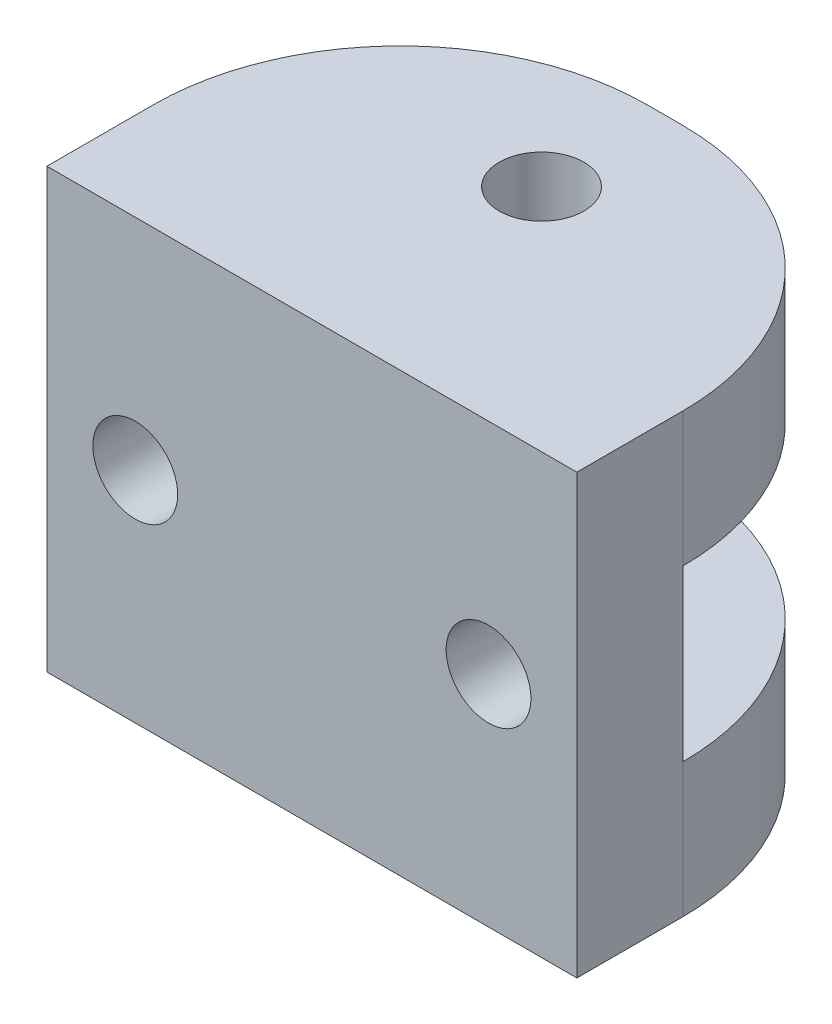
ISO-10303-21;
HEADER;
FILE_DESCRIPTION(('STEP AP214'),'2;1');
FILE_NAME('part.step','',(''),(''),'','','');
FILE_SCHEMA(('AUTOMOTIVE_DESIGN { 1 0 10303 214 1 1 1 1 }'));
ENDSEC;
DATA;
#1=APPLICATION_CONTEXT('core data for automotive mechanical design processes');
#2=APPLICATION_PROTOCOL_DEFINITION('international standard','automotive_design',2000,#1);
#3=PRODUCT_CONTEXT('',#1,'mechanical');
#4=PRODUCT('Part','Part','',(#3));
#5=PRODUCT_RELATED_PRODUCT_CATEGORY('part','',(#4));
#6=PRODUCT_DEFINITION_FORMATION('','',#4);
#7=PRODUCT_DEFINITION_CONTEXT('part definition',#1,'design');
#8=PRODUCT_DEFINITION('design','',#6,#7);
#9=PRODUCT_DEFINITION_SHAPE('','',#8);
#10=(LENGTH_UNIT() NAMED_UNIT(*) SI_UNIT(.MILLI.,.METRE.));
#11=(NAMED_UNIT(*) PLANE_ANGLE_UNIT() SI_UNIT($,.RADIAN.));
#12=(NAMED_UNIT(*) SI_UNIT($,.STERADIAN.) SOLID_ANGLE_UNIT());
#13=UNCERTAINTY_MEASURE_WITH_UNIT(LENGTH_MEASURE(1.E-05),#10,'distance_accuracy_value','');
#14=(GEOMETRIC_REPRESENTATION_CONTEXT(3) GLOBAL_UNCERTAINTY_ASSIGNED_CONTEXT((#13)) GLOBAL_UNIT_ASSIGNED_CONTEXT((#10,
#11,#12)) REPRESENTATION_CONTEXT('',''));
#15=CARTESIAN_POINT('',(0.,0.,0.));
#16=DIRECTION('',(0.,0.,1.));
#17=DIRECTION('',(1.,0.,0.));
#18=AXIS2_PLACEMENT_3D('',#15,#16,#17);
#19=CARTESIAN_POINT('',(75.,0.,0.));
#20=DIRECTION('',(0.,0.,-1.));
#21=DIRECTION('',(-1.,0.,0.));
#22=AXIS2_PLACEMENT_3D('',#19,#20,#21);
#23=PLANE('',#22);
#24=CARTESIAN_POINT('',(62.5,31.,0.));
#25=DIRECTION('',(0.,0.,1.));
#26=DIRECTION('',(1.,0.,0.));
#27=AXIS2_PLACEMENT_3D('',#24,#25,#26);
#28=CIRCLE('',#27,5.99999999999998);
#29=CARTESIAN_POINT('',(68.5,31.,0.));
#30=VERTEX_POINT('',#29);
#31=EDGE_CURVE('E151',#30,#30,#28,.T.);
#32=ORIENTED_EDGE('',*,*,#31,.F.);
#33=EDGE_LOOP('',(#32));
#34=FACE_BOUND('',#33,.T.);
#35=CARTESIAN_POINT('',(12.5,31.,0.));
#36=DIRECTION('',(0.,0.,1.));
#37=DIRECTION('',(1.,0.,0.));
#38=AXIS2_PLACEMENT_3D('',#35,#36,#37);
#39=CIRCLE('',#38,6.);
#40=CARTESIAN_POINT('',(18.5,31.,0.));
#41=VERTEX_POINT('',#40);
#42=EDGE_CURVE('E283',#41,#41,#39,.T.);
#43=ORIENTED_EDGE('',*,*,#42,.F.);
#44=EDGE_LOOP('',(#43));
#45=FACE_BOUND('',#44,.T.);
#46=DIRECTION('',(0.,-1.,0.));
#47=VECTOR('',#46,1.);
#48=CARTESIAN_POINT('',(0.,0.,0.));
#49=LINE('',#48,#47);
#50=CARTESIAN_POINT('',(0.,62.,0.));
#51=VERTEX_POINT('',#50);
#52=CARTESIAN_POINT('',(0.,0.,0.));
#53=VERTEX_POINT('',#52);
#54=EDGE_CURVE('E136',#51,#53,#49,.T.);
#55=ORIENTED_EDGE('',*,*,#54,.T.);
#56=DIRECTION('',(-1.,0.,0.));
#57=VECTOR('',#56,1.);
#58=CARTESIAN_POINT('',(75.,0.,0.));
#59=LINE('',#58,#57);
#60=CARTESIAN_POINT('',(75.,0.,0.));
#61=VERTEX_POINT('',#60);
#62=EDGE_CURVE('E115',#61,#53,#59,.T.);
#63=ORIENTED_EDGE('',*,*,#62,.F.);
#64=DIRECTION('',(0.,-1.,0.));
#65=VECTOR('',#64,1.);
#66=CARTESIAN_POINT('',(75.,0.,0.));
#67=LINE('',#66,#65);
#68=CARTESIAN_POINT('',(75.,62.,0.));
#69=VERTEX_POINT('',#68);
#70=EDGE_CURVE('E123',#69,#61,#67,.T.);
#71=ORIENTED_EDGE('',*,*,#70,.F.);
#72=DIRECTION('',(-1.,0.,0.));
#73=VECTOR('',#72,1.);
#74=CARTESIAN_POINT('',(75.,62.,0.));
#75=LINE('',#74,#73);
#76=EDGE_CURVE('E203',#69,#51,#75,.T.);
#77=ORIENTED_EDGE('',*,*,#76,.T.);
#78=EDGE_LOOP('',(#55,#63,#71,#77));
#79=FACE_BOUND('',#78,.T.);
#80=ADVANCED_FACE('F32',(#34,#45,#79),#23,.F.);
#81=CARTESIAN_POINT('',(75.,0.,0.));
#82=DIRECTION('',(0.,1.,0.));
#83=DIRECTION('',(0.,0.,1.));
#84=AXIS2_PLACEMENT_3D('',#81,#82,#83);
#85=PLANE('',#84);
#86=CARTESIAN_POINT('',(37.5,0.,-32.5));
#87=DIRECTION('',(0.,1.,0.));
#88=DIRECTION('',(0.,0.,1.));
#89=AXIS2_PLACEMENT_3D('',#86,#87,#88);
#90=CIRCLE('',#89,5.99999999999999);
#91=CARTESIAN_POINT('',(37.5,0.,-26.5));
#92=VERTEX_POINT('',#91);
#93=EDGE_CURVE('E408',#92,#92,#90,.T.);
#94=ORIENTED_EDGE('',*,*,#93,.T.);
#95=EDGE_LOOP('',(#94));
#96=FACE_BOUND('',#95,.T.);
#97=DIRECTION('',(-1.,0.,0.));
#98=VECTOR('',#97,1.);
#99=CARTESIAN_POINT('',(75.,0.,-50.));
#100=LINE('',#99,#98);
#101=CARTESIAN_POINT('',(40.,0.,-50.));
#102=VERTEX_POINT('',#101);
#103=CARTESIAN_POINT('',(35.,0.,-50.));
#104=VERTEX_POINT('',#103);
#105=EDGE_CURVE('E138',#102,#104,#100,.T.);
#106=ORIENTED_EDGE('',*,*,#105,.F.);
#107=CARTESIAN_POINT('',(40.,0.,-15.));
#108=DIRECTION('',(0.,1.,0.));
#109=DIRECTION('',(0.,0.,1.));
#110=AXIS2_PLACEMENT_3D('',#107,#108,#109);
#111=CIRCLE('',#110,35.);
#112=CARTESIAN_POINT('',(75.,0.,-15.));
#113=VERTEX_POINT('',#112);
#114=EDGE_CURVE('E118',#102,#113,#111,.F.);
#115=ORIENTED_EDGE('',*,*,#114,.T.);
#116=DIRECTION('',(0.,0.,-1.));
#117=VECTOR('',#116,1.);
#118=CARTESIAN_POINT('',(75.,0.,0.));
#119=LINE('',#118,#117);
#120=EDGE_CURVE('E109',#61,#113,#119,.T.);
#121=ORIENTED_EDGE('',*,*,#120,.F.);
#122=ORIENTED_EDGE('',*,*,#62,.T.);
#123=DIRECTION('',(0.,0.,-1.));
#124=VECTOR('',#123,1.);
#125=CARTESIAN_POINT('',(0.,0.,0.));
#126=LINE('',#125,#124);
#127=CARTESIAN_POINT('',(0.,0.,-15.));
#128=VERTEX_POINT('',#127);
#129=EDGE_CURVE('E293',#53,#128,#126,.T.);
#130=ORIENTED_EDGE('',*,*,#129,.T.);
#131=CARTESIAN_POINT('',(35.,0.,-15.));
#132=DIRECTION('',(0.,1.,0.));
#133=DIRECTION('',(0.,0.,1.));
#134=AXIS2_PLACEMENT_3D('',#131,#132,#133);
#135=CIRCLE('',#134,35.);
#136=EDGE_CURVE('E164',#128,#104,#135,.F.);
#137=ORIENTED_EDGE('',*,*,#136,.T.);
#138=EDGE_LOOP('',(#106,#115,#121,#122,#130,#137));
#139=FACE_BOUND('',#138,.T.);
#140=ADVANCED_FACE('F112',(#96,#139),#85,.F.);
#141=CARTESIAN_POINT('',(75.,19.,-50.));
#142=DIRECTION('',(0.,0.,1.));
#143=DIRECTION('',(1.,0.,0.));
#144=AXIS2_PLACEMENT_3D('',#141,#142,#143);
#145=PLANE('',#144);
#146=DIRECTION('',(-1.,0.,0.));
#147=VECTOR('',#146,1.);
#148=CARTESIAN_POINT('',(75.,19.,-50.));
#149=LINE('',#148,#147);
#150=CARTESIAN_POINT('',(40.,19.,-50.));
#151=VERTEX_POINT('',#150);
#152=CARTESIAN_POINT('',(35.,19.,-50.));
#153=VERTEX_POINT('',#152);
#154=EDGE_CURVE('E143',#151,#153,#149,.T.);
#155=ORIENTED_EDGE('',*,*,#154,.F.);
#156=DIRECTION('',(0.,1.,0.));
#157=VECTOR('',#156,1.);
#158=CARTESIAN_POINT('',(40.,19.,-50.));
#159=LINE('',#158,#157);
#160=EDGE_CURVE('E162',#151,#102,#159,.F.);
#161=ORIENTED_EDGE('',*,*,#160,.T.);
#162=ORIENTED_EDGE('',*,*,#105,.T.);
#163=DIRECTION('',(0.,1.,0.));
#164=VECTOR('',#163,1.);
#165=CARTESIAN_POINT('',(35.,19.,-50.));
#166=LINE('',#165,#164);
#167=EDGE_CURVE('E159',#104,#153,#166,.T.);
#168=ORIENTED_EDGE('',*,*,#167,.T.);
#169=EDGE_LOOP('',(#155,#161,#162,#168));
#170=FACE_BOUND('',#169,.T.);
#171=ADVANCED_FACE('F215',(#170),#145,.F.);
#172=CARTESIAN_POINT('',(75.,19.,-15.));
#173=DIRECTION('',(0.,-1.,0.));
#174=DIRECTION('',(0.,0.,-1.));
#175=AXIS2_PLACEMENT_3D('',#172,#173,#174);
#176=PLANE('',#175);
#177=CARTESIAN_POINT('',(37.5,19.,-32.5));
#178=DIRECTION('',(0.,-1.,0.));
#179=DIRECTION('',(0.,0.,-1.));
#180=AXIS2_PLACEMENT_3D('',#177,#178,#179);
#181=CIRCLE('',#180,5.99999999999999);
#182=CARTESIAN_POINT('',(37.5,19.,-38.5));
#183=VERTEX_POINT('',#182);
#184=EDGE_CURVE('E286',#183,#183,#181,.T.);
#185=ORIENTED_EDGE('',*,*,#184,.T.);
#186=EDGE_LOOP('',(#185));
#187=FACE_BOUND('',#186,.T.);
#188=DIRECTION('',(-1.,0.,0.));
#189=VECTOR('',#188,1.);
#190=CARTESIAN_POINT('',(75.,19.,-15.));
#191=LINE('',#190,#189);
#192=CARTESIAN_POINT('',(75.,19.,-15.));
#193=VERTEX_POINT('',#192);
#194=CARTESIAN_POINT('',(0.,19.,-15.));
#195=VERTEX_POINT('',#194);
#196=EDGE_CURVE('E195',#193,#195,#191,.T.);
#197=ORIENTED_EDGE('',*,*,#196,.F.);
#198=CARTESIAN_POINT('',(40.,19.,-15.));
#199=DIRECTION('',(0.,-1.,0.));
#200=DIRECTION('',(0.,0.,-1.));
#201=AXIS2_PLACEMENT_3D('',#198,#199,#200);
#202=CIRCLE('',#201,35.);
#203=EDGE_CURVE('E157',#193,#151,#202,.F.);
#204=ORIENTED_EDGE('',*,*,#203,.T.);
#205=ORIENTED_EDGE('',*,*,#154,.T.);
#206=CARTESIAN_POINT('',(35.,19.,-15.));
#207=DIRECTION('',(0.,-1.,0.));
#208=DIRECTION('',(0.,0.,-1.));
#209=AXIS2_PLACEMENT_3D('',#206,#207,#208);
#210=CIRCLE('',#209,35.);
#211=EDGE_CURVE('E155',#153,#195,#210,.F.);
#212=ORIENTED_EDGE('',*,*,#211,.T.);
#213=EDGE_LOOP('',(#197,#204,#205,#212));
#214=FACE_BOUND('',#213,.T.);
#215=ADVANCED_FACE('F212',(#187,#214),#176,.F.);
#216=CARTESIAN_POINT('',(75.,43.,-15.));
#217=DIRECTION('',(0.,0.,1.));
#218=DIRECTION('',(1.,0.,0.));
#219=AXIS2_PLACEMENT_3D('',#216,#217,#218);
#220=PLANE('',#219);
#221=CARTESIAN_POINT('',(62.5,31.,-15.));
#222=DIRECTION('',(0.,0.,1.));
#223=DIRECTION('',(1.,0.,0.));
#224=AXIS2_PLACEMENT_3D('',#221,#222,#223);
#225=CIRCLE('',#224,5.99999999999998);
#226=CARTESIAN_POINT('',(68.5,31.,-15.));
#227=VERTEX_POINT('',#226);
#228=EDGE_CURVE('E150',#227,#227,#225,.T.);
#229=ORIENTED_EDGE('',*,*,#228,.T.);
#230=EDGE_LOOP('',(#229));
#231=FACE_BOUND('',#230,.T.);
#232=CARTESIAN_POINT('',(12.5,31.,-15.));
#233=DIRECTION('',(0.,0.,1.));
#234=DIRECTION('',(1.,0.,0.));
#235=AXIS2_PLACEMENT_3D('',#232,#233,#234);
#236=CIRCLE('',#235,6.);
#237=CARTESIAN_POINT('',(18.5,31.,-15.));
#238=VERTEX_POINT('',#237);
#239=EDGE_CURVE('E147',#238,#238,#236,.T.);
#240=ORIENTED_EDGE('',*,*,#239,.T.);
#241=EDGE_LOOP('',(#240));
#242=FACE_BOUND('',#241,.T.);
#243=DIRECTION('',(0.,1.,0.));
#244=VECTOR('',#243,1.);
#245=CARTESIAN_POINT('',(0.,43.,-15.));
#246=LINE('',#245,#244);
#247=CARTESIAN_POINT('',(0.,43.,-15.));
#248=VERTEX_POINT('',#247);
#249=EDGE_CURVE('E194',#195,#248,#246,.T.);
#250=ORIENTED_EDGE('',*,*,#249,.T.);
#251=DIRECTION('',(-1.,0.,0.));
#252=VECTOR('',#251,1.);
#253=CARTESIAN_POINT('',(75.,43.,-15.));
#254=LINE('',#253,#252);
#255=CARTESIAN_POINT('',(75.,43.,-15.));
#256=VERTEX_POINT('',#255);
#257=EDGE_CURVE('E182',#256,#248,#254,.T.);
#258=ORIENTED_EDGE('',*,*,#257,.F.);
#259=DIRECTION('',(0.,1.,0.));
#260=VECTOR('',#259,1.);
#261=CARTESIAN_POINT('',(75.,43.,-15.));
#262=LINE('',#261,#260);
#263=EDGE_CURVE('E122',#193,#256,#262,.T.);
#264=ORIENTED_EDGE('',*,*,#263,.F.);
#265=ORIENTED_EDGE('',*,*,#196,.T.);
#266=EDGE_LOOP('',(#250,#258,#264,#265));
#267=FACE_BOUND('',#266,.T.);
#268=ADVANCED_FACE('F192',(#231,#242,#267),#220,.F.);
#269=CARTESIAN_POINT('',(75.,43.,-50.));
#270=DIRECTION('',(0.,1.,0.));
#271=DIRECTION('',(0.,0.,1.));
#272=AXIS2_PLACEMENT_3D('',#269,#270,#271);
#273=PLANE('',#272);
#274=CARTESIAN_POINT('',(37.5,43.,-32.5));
#275=DIRECTION('',(0.,1.,0.));
#276=DIRECTION('',(0.,0.,1.));
#277=AXIS2_PLACEMENT_3D('',#274,#275,#276);
#278=CIRCLE('',#277,5.99999999999999);
#279=CARTESIAN_POINT('',(37.5,43.,-26.5));
#280=VERTEX_POINT('',#279);
#281=EDGE_CURVE('E405',#280,#280,#278,.T.);
#282=ORIENTED_EDGE('',*,*,#281,.T.);
#283=EDGE_LOOP('',(#282));
#284=FACE_BOUND('',#283,.T.);
#285=ORIENTED_EDGE('',*,*,#257,.T.);
#286=CARTESIAN_POINT('',(35.,43.,-15.));
#287=DIRECTION('',(0.,1.,0.));
#288=DIRECTION('',(0.,0.,1.));
#289=AXIS2_PLACEMENT_3D('',#286,#287,#288);
#290=CIRCLE('',#289,35.);
#291=CARTESIAN_POINT('',(35.,43.,-50.));
#292=VERTEX_POINT('',#291);
#293=EDGE_CURVE('E11',#248,#292,#290,.F.);
#294=ORIENTED_EDGE('',*,*,#293,.T.);
#295=DIRECTION('',(-1.,0.,0.));
#296=VECTOR('',#295,1.);
#297=CARTESIAN_POINT('',(75.,43.,-50.));
#298=LINE('',#297,#296);
#299=CARTESIAN_POINT('',(40.,43.,-50.));
#300=VERTEX_POINT('',#299);
#301=EDGE_CURVE('E183',#300,#292,#298,.T.);
#302=ORIENTED_EDGE('',*,*,#301,.F.);
#303=CARTESIAN_POINT('',(40.,43.,-15.));
#304=DIRECTION('',(0.,1.,0.));
#305=DIRECTION('',(0.,0.,1.));
#306=AXIS2_PLACEMENT_3D('',#303,#304,#305);
#307=CIRCLE('',#306,35.);
#308=EDGE_CURVE('E40',#300,#256,#307,.F.);
#309=ORIENTED_EDGE('',*,*,#308,.T.);
#310=EDGE_LOOP('',(#285,#294,#302,#309));
#311=FACE_BOUND('',#310,.T.);
#312=ADVANCED_FACE('F180',(#284,#311),#273,.F.);
#313=CARTESIAN_POINT('',(75.,62.,-50.));
#314=DIRECTION('',(0.,0.,1.));
#315=DIRECTION('',(1.,0.,0.));
#316=AXIS2_PLACEMENT_3D('',#313,#314,#315);
#317=PLANE('',#316);
#318=ORIENTED_EDGE('',*,*,#301,.T.);
#319=DIRECTION('',(0.,1.,0.));
#320=VECTOR('',#319,1.);
#321=CARTESIAN_POINT('',(35.,62.,-50.));
#322=LINE('',#321,#320);
#323=CARTESIAN_POINT('',(35.,62.,-50.));
#324=VERTEX_POINT('',#323);
#325=EDGE_CURVE('E172',#292,#324,#322,.T.);
#326=ORIENTED_EDGE('',*,*,#325,.T.);
#327=DIRECTION('',(-1.,0.,0.));
#328=VECTOR('',#327,1.);
#329=CARTESIAN_POINT('',(75.,62.,-50.));
#330=LINE('',#329,#328);
#331=CARTESIAN_POINT('',(40.,62.,-50.));
#332=VERTEX_POINT('',#331);
#333=EDGE_CURVE('E200',#332,#324,#330,.T.);
#334=ORIENTED_EDGE('',*,*,#333,.F.);
#335=DIRECTION('',(0.,1.,0.));
#336=VECTOR('',#335,1.);
#337=CARTESIAN_POINT('',(40.,62.,-50.));
#338=LINE('',#337,#336);
#339=EDGE_CURVE('E52',#332,#300,#338,.F.);
#340=ORIENTED_EDGE('',*,*,#339,.T.);
#341=EDGE_LOOP('',(#318,#326,#334,#340));
#342=FACE_BOUND('',#341,.T.);
#343=ADVANCED_FACE('F201',(#342),#317,.F.);
#344=CARTESIAN_POINT('',(75.,62.,0.));
#345=DIRECTION('',(0.,-1.,0.));
#346=DIRECTION('',(0.,0.,-1.));
#347=AXIS2_PLACEMENT_3D('',#344,#345,#346);
#348=PLANE('',#347);
#349=CARTESIAN_POINT('',(37.5,62.,-32.5));
#350=DIRECTION('',(0.,1.,0.));
#351=DIRECTION('',(0.,0.,1.));
#352=AXIS2_PLACEMENT_3D('',#349,#350,#351);
#353=CIRCLE('',#352,5.99999999999999);
#354=CARTESIAN_POINT('',(37.5,62.,-26.5));
#355=VERTEX_POINT('',#354);
#356=EDGE_CURVE('E409',#355,#355,#353,.T.);
#357=ORIENTED_EDGE('',*,*,#356,.F.);
#358=EDGE_LOOP('',(#357));
#359=FACE_BOUND('',#358,.T.);
#360=ORIENTED_EDGE('',*,*,#333,.T.);
#361=CARTESIAN_POINT('',(35.,62.,-15.));
#362=DIRECTION('',(0.,-1.,0.));
#363=DIRECTION('',(0.,0.,-1.));
#364=AXIS2_PLACEMENT_3D('',#361,#362,#363);
#365=CIRCLE('',#364,35.);
#366=CARTESIAN_POINT('',(0.,62.,-15.));
#367=VERTEX_POINT('',#366);
#368=EDGE_CURVE('E177',#324,#367,#365,.F.);
#369=ORIENTED_EDGE('',*,*,#368,.T.);
#370=DIRECTION('',(0.,0.,1.));
#371=VECTOR('',#370,1.);
#372=CARTESIAN_POINT('',(0.,62.,0.));
#373=LINE('',#372,#371);
#374=EDGE_CURVE('E133',#367,#51,#373,.T.);
#375=ORIENTED_EDGE('',*,*,#374,.T.);
#376=ORIENTED_EDGE('',*,*,#76,.F.);
#377=DIRECTION('',(0.,0.,1.));
#378=VECTOR('',#377,1.);
#379=CARTESIAN_POINT('',(75.,62.,0.));
#380=LINE('',#379,#378);
#381=CARTESIAN_POINT('',(75.,62.,-15.));
#382=VERTEX_POINT('',#381);
#383=EDGE_CURVE('E129',#382,#69,#380,.T.);
#384=ORIENTED_EDGE('',*,*,#383,.F.);
#385=CARTESIAN_POINT('',(40.,62.,-15.));
#386=DIRECTION('',(0.,-1.,0.));
#387=DIRECTION('',(0.,0.,-1.));
#388=AXIS2_PLACEMENT_3D('',#385,#386,#387);
#389=CIRCLE('',#388,35.);
#390=EDGE_CURVE('E175',#382,#332,#389,.F.);
#391=ORIENTED_EDGE('',*,*,#390,.T.);
#392=EDGE_LOOP('',(#360,#369,#375,#376,#384,#391));
#393=FACE_BOUND('',#392,.T.);
#394=ADVANCED_FACE('F199',(#359,#393),#348,.F.);
#395=CARTESIAN_POINT('',(75.,0.,0.));
#396=DIRECTION('',(-1.,0.,0.));
#397=DIRECTION('',(0.,0.,1.));
#398=AXIS2_PLACEMENT_3D('',#395,#396,#397);
#399=PLANE('',#398);
#400=ORIENTED_EDGE('',*,*,#120,.T.);
#401=DIRECTION('',(0.,1.,0.));
#402=VECTOR('',#401,1.);
#403=CARTESIAN_POINT('',(75.,0.,-15.));
#404=LINE('',#403,#402);
#405=EDGE_CURVE('E140',#113,#193,#404,.T.);
#406=ORIENTED_EDGE('',*,*,#405,.T.);
#407=ORIENTED_EDGE('',*,*,#263,.T.);
#408=DIRECTION('',(0.,1.,0.));
#409=VECTOR('',#408,1.);
#410=CARTESIAN_POINT('',(75.,0.,-15.));
#411=LINE('',#410,#409);
#412=EDGE_CURVE('E137',#256,#382,#411,.T.);
#413=ORIENTED_EDGE('',*,*,#412,.T.);
#414=ORIENTED_EDGE('',*,*,#383,.T.);
#415=ORIENTED_EDGE('',*,*,#70,.T.);
#416=EDGE_LOOP('',(#400,#406,#407,#413,#414,#415));
#417=FACE_BOUND('',#416,.T.);
#418=ADVANCED_FACE('F126',(#417),#399,.F.);
#419=CARTESIAN_POINT('',(0.,0.,0.));
#420=DIRECTION('',(-1.,0.,0.));
#421=DIRECTION('',(0.,0.,1.));
#422=AXIS2_PLACEMENT_3D('',#419,#420,#421);
#423=PLANE('',#422);
#424=ORIENTED_EDGE('',*,*,#249,.F.);
#425=DIRECTION('',(0.,1.,0.));
#426=VECTOR('',#425,1.);
#427=CARTESIAN_POINT('',(0.,0.,-15.));
#428=LINE('',#427,#426);
#429=EDGE_CURVE('E169',#195,#128,#428,.F.);
#430=ORIENTED_EDGE('',*,*,#429,.T.);
#431=ORIENTED_EDGE('',*,*,#129,.F.);
#432=ORIENTED_EDGE('',*,*,#54,.F.);
#433=ORIENTED_EDGE('',*,*,#374,.F.);
#434=DIRECTION('',(0.,1.,0.));
#435=VECTOR('',#434,1.);
#436=CARTESIAN_POINT('',(0.,43.,-15.));
#437=LINE('',#436,#435);
#438=EDGE_CURVE('E167',#367,#248,#437,.F.);
#439=ORIENTED_EDGE('',*,*,#438,.T.);
#440=EDGE_LOOP('',(#424,#430,#431,#432,#433,#439));
#441=FACE_BOUND('',#440,.T.);
#442=ADVANCED_FACE('F260',(#441),#423,.T.);
#443=CARTESIAN_POINT('',(12.5,31.,-50.));
#444=DIRECTION('',(0.,0.,1.));
#445=DIRECTION('',(1.,0.,0.));
#446=AXIS2_PLACEMENT_3D('',#443,#444,#445);
#447=CYLINDRICAL_SURFACE('',#446,6.);
#448=ORIENTED_EDGE('',*,*,#42,.T.);
#449=EDGE_LOOP('',(#448));
#450=FACE_BOUND('',#449,.T.);
#451=ORIENTED_EDGE('',*,*,#239,.F.);
#452=EDGE_LOOP('',(#451));
#453=FACE_BOUND('',#452,.T.);
#454=ADVANCED_FACE('F263',(#450,#453),#447,.F.);
#455=CARTESIAN_POINT('',(62.5,31.,-50.));
#456=DIRECTION('',(0.,0.,1.));
#457=DIRECTION('',(1.,0.,0.));
#458=AXIS2_PLACEMENT_3D('',#455,#456,#457);
#459=CYLINDRICAL_SURFACE('',#458,5.99999999999998);
#460=ORIENTED_EDGE('',*,*,#31,.T.);
#461=EDGE_LOOP('',(#460));
#462=FACE_BOUND('',#461,.T.);
#463=ORIENTED_EDGE('',*,*,#228,.F.);
#464=EDGE_LOOP('',(#463));
#465=FACE_BOUND('',#464,.T.);
#466=ADVANCED_FACE('F269',(#462,#465),#459,.F.);
#467=CARTESIAN_POINT('',(37.5,0.,-32.5));
#468=DIRECTION('',(0.,1.,0.));
#469=DIRECTION('',(0.,0.,1.));
#470=AXIS2_PLACEMENT_3D('',#467,#468,#469);
#471=CYLINDRICAL_SURFACE('',#470,5.99999999999999);
#472=ORIENTED_EDGE('',*,*,#356,.T.);
#473=EDGE_LOOP('',(#472));
#474=FACE_BOUND('',#473,.T.);
#475=ORIENTED_EDGE('',*,*,#281,.F.);
#476=EDGE_LOOP('',(#475));
#477=FACE_BOUND('',#476,.T.);
#478=ADVANCED_FACE('F230',(#474,#477),#471,.F.);
#479=ORIENTED_EDGE('',*,*,#93,.F.);
#480=EDGE_LOOP('',(#479));
#481=FACE_BOUND('',#480,.T.);
#482=ORIENTED_EDGE('',*,*,#184,.F.);
#483=EDGE_LOOP('',(#482));
#484=FACE_BOUND('',#483,.T.);
#485=ADVANCED_FACE('F221',(#481,#484),#471,.F.);
#486=CARTESIAN_POINT('',(40.,0.,-15.));
#487=DIRECTION('',(0.,1.,0.));
#488=DIRECTION('',(0.,0.,1.));
#489=AXIS2_PLACEMENT_3D('',#486,#487,#488);
#490=CYLINDRICAL_SURFACE('',#489,35.);
#491=ORIENTED_EDGE('',*,*,#114,.F.);
#492=ORIENTED_EDGE('',*,*,#160,.F.);
#493=ORIENTED_EDGE('',*,*,#203,.F.);
#494=ORIENTED_EDGE('',*,*,#405,.F.);
#495=EDGE_LOOP('',(#491,#492,#493,#494));
#496=FACE_BOUND('',#495,.T.);
#497=ADVANCED_FACE('F218',(#496),#490,.T.);
#498=CARTESIAN_POINT('',(35.,19.,-15.));
#499=DIRECTION('',(0.,-1.,0.));
#500=DIRECTION('',(0.,0.,-1.));
#501=AXIS2_PLACEMENT_3D('',#498,#499,#500);
#502=CYLINDRICAL_SURFACE('',#501,35.);
#503=ORIENTED_EDGE('',*,*,#136,.F.);
#504=ORIENTED_EDGE('',*,*,#429,.F.);
#505=ORIENTED_EDGE('',*,*,#211,.F.);
#506=ORIENTED_EDGE('',*,*,#167,.F.);
#507=EDGE_LOOP('',(#503,#504,#505,#506));
#508=FACE_BOUND('',#507,.T.);
#509=ADVANCED_FACE('F220',(#508),#502,.T.);
#510=CARTESIAN_POINT('',(35.,62.,-15.));
#511=DIRECTION('',(0.,-1.,0.));
#512=DIRECTION('',(0.,0.,-1.));
#513=AXIS2_PLACEMENT_3D('',#510,#511,#512);
#514=CYLINDRICAL_SURFACE('',#513,35.);
#515=ORIENTED_EDGE('',*,*,#293,.F.);
#516=ORIENTED_EDGE('',*,*,#438,.F.);
#517=ORIENTED_EDGE('',*,*,#368,.F.);
#518=ORIENTED_EDGE('',*,*,#325,.F.);
#519=EDGE_LOOP('',(#515,#516,#517,#518));
#520=FACE_BOUND('',#519,.T.);
#521=ADVANCED_FACE('F227',(#520),#514,.T.);
#522=CARTESIAN_POINT('',(40.,0.,-15.));
#523=DIRECTION('',(0.,1.,0.));
#524=DIRECTION('',(0.,0.,1.));
#525=AXIS2_PLACEMENT_3D('',#522,#523,#524);
#526=CYLINDRICAL_SURFACE('',#525,35.);
#527=ORIENTED_EDGE('',*,*,#308,.F.);
#528=ORIENTED_EDGE('',*,*,#339,.F.);
#529=ORIENTED_EDGE('',*,*,#390,.F.);
#530=ORIENTED_EDGE('',*,*,#412,.F.);
#531=EDGE_LOOP('',(#527,#528,#529,#530));
#532=FACE_BOUND('',#531,.T.);
#533=ADVANCED_FACE('F34',(#532),#526,.T.);
#534=CLOSED_SHELL('',(#80,#140,#171,#215,#268,#312,#343,#394,#418,#442,#454,#466,#478,#485,#497,
#509,#521,#533));
#535=MANIFOLD_SOLID_BREP('B2',#534);
#536=ADVANCED_BREP_SHAPE_REPRESENTATION('',(#18,#535),#14);
#537=SHAPE_DEFINITION_REPRESENTATION(#9,#536);
ENDSEC;
END-ISO-10303-21;
